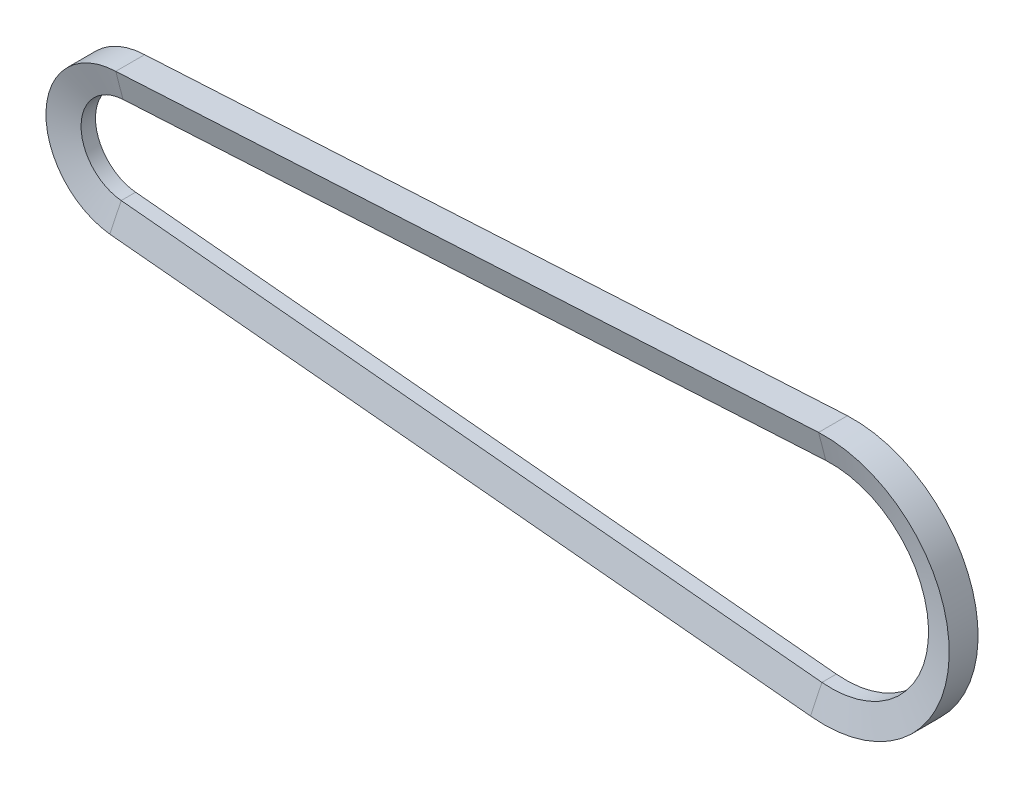
ISO-10303-21;
HEADER;
FILE_DESCRIPTION(('STEP AP214'),'2;1');
FILE_NAME('part.step','',(''),(''),'','','');
FILE_SCHEMA(('AUTOMOTIVE_DESIGN { 1 0 10303 214 1 1 1 1 }'));
ENDSEC;
DATA;
#1=APPLICATION_CONTEXT('core data for automotive mechanical design processes');
#2=APPLICATION_PROTOCOL_DEFINITION('international standard','automotive_design',2000,#1);
#3=PRODUCT_CONTEXT('',#1,'mechanical');
#4=PRODUCT('Part','Part','',(#3));
#5=PRODUCT_RELATED_PRODUCT_CATEGORY('part','',(#4));
#6=PRODUCT_DEFINITION_FORMATION('','',#4);
#7=PRODUCT_DEFINITION_CONTEXT('part definition',#1,'design');
#8=PRODUCT_DEFINITION('design','',#6,#7);
#9=PRODUCT_DEFINITION_SHAPE('','',#8);
#10=(LENGTH_UNIT() NAMED_UNIT(*) SI_UNIT(.MILLI.,.METRE.));
#11=(NAMED_UNIT(*) PLANE_ANGLE_UNIT() SI_UNIT($,.RADIAN.));
#12=(NAMED_UNIT(*) SI_UNIT($,.STERADIAN.) SOLID_ANGLE_UNIT());
#13=UNCERTAINTY_MEASURE_WITH_UNIT(LENGTH_MEASURE(1.E-05),#10,'distance_accuracy_value','');
#14=(GEOMETRIC_REPRESENTATION_CONTEXT(3) GLOBAL_UNCERTAINTY_ASSIGNED_CONTEXT((#13)) GLOBAL_UNIT_ASSIGNED_CONTEXT((#10,
#11,#12)) REPRESENTATION_CONTEXT('',''));
#15=CARTESIAN_POINT('',(0.,0.,0.));
#16=DIRECTION('',(0.,0.,1.));
#17=DIRECTION('',(1.,0.,0.));
#18=AXIS2_PLACEMENT_3D('',#15,#16,#17);
#19=CARTESIAN_POINT('',(-1.86422081923545,-17.2680872712014,2.));
#20=CARTESIAN_POINT('',(8.86465794915136,-18.4263510008753,2.));
#21=CARTESIAN_POINT('',(17.0099433516367,-11.3478808126017,2.));
#22=CARTESIAN_POINT('',(17.3593189672023,-0.562318649530724,2.));
#23=CARTESIAN_POINT('',(17.708694582768,10.2232435135402,2.));
#24=CARTESIAN_POINT('',(10.0385885943282,17.8140200627688,2.));
#25=CARTESIAN_POINT('',(-0.742758535199014,17.3525348876492,2.));
#26=CARTESIAN_POINT('',(-1.28422785180058,-13.4387781745462,0.999999999999999));
#27=CARTESIAN_POINT('',(7.06545324289761,-14.2366850137089,0.999999999999999));
#28=CARTESIAN_POINT('',(13.3285825573353,-8.65752370596974,0.999999999999999));
#29=CARTESIAN_POINT('',(13.497269617516,-0.271501145609515,0.999999999999999));
#30=CARTESIAN_POINT('',(13.6659566776966,8.11452141475071,0.999999999999999));
#31=CARTESIAN_POINT('',(7.63225556271675,13.9410367165614,0.999999999999999));
#32=CARTESIAN_POINT('',(-0.742758535199014,13.4795515414418,0.999999999999999));
#33=(BOUNDED_SURFACE() B_SPLINE_SURFACE(1,3,((#19,#20,#21,#22,#23,#24,#25),(#26,#27,#28,#29,#30,
#31,#32)),.UNSPECIFIED.,.F.,.F.,.F.) B_SPLINE_SURFACE_WITH_KNOTS((2,2),(4,3,4),(0.,1.),(0.,0.5,
1.),.UNSPECIFIED.) GEOMETRIC_REPRESENTATION_ITEM() RATIONAL_B_SPLINE_SURFACE(((1.,
0.786693931378275,0.786693931378275,1.,0.786693931378275,0.786693931378275,1.),(1.,
0.786693931378275,0.786693931378275,1.,0.786693931378275,0.786693931378275,1.))) REPRESENTATION_ITEM('') SURFACE());
#34=DIRECTION('',(0.144998241858716,0.957327274163795,-0.25));
#35=VECTOR('',#34,1.);
#36=CARTESIAN_POINT('',(-1.86422081923545,-17.2680872712014,2.));
#37=LINE('',#36,#35);
#38=CARTESIAN_POINT('',(-1.86422081923544,-17.2680872712016,2.));
#39=VERTEX_POINT('',#38);
#40=CARTESIAN_POINT('',(-1.28422785180059,-13.4387781745464,0.999999999999999));
#41=VERTEX_POINT('',#40);
#42=EDGE_CURVE('E149',#39,#41,#37,.T.);
#43=CARTESIAN_POINT('',(-4.16333634234434E-13,0.,2.));
#44=DIRECTION('',(0.,0.,1.));
#45=DIRECTION('',(-0.107333906847763,-0.994223029526472,0.));
#46=AXIS2_PLACEMENT_3D('',#43,#44,#45);
#47=CIRCLE('',#46,17.3684241446567);
#48=CARTESIAN_POINT('',(-0.742758535198196,17.3525348876494,2.));
#49=VERTEX_POINT('',#48);
#50=EDGE_CURVE('E148',#39,#49,#47,.T.);
#51=DIRECTION('',(0.,-0.968245836551854,-0.25));
#52=VECTOR('',#51,1.);
#53=CARTESIAN_POINT('',(-0.742758535198196,17.3525348876494,2.));
#54=LINE('',#53,#52);
#55=CARTESIAN_POINT('',(-0.742758535198196,13.479551541442,0.999999999999999));
#56=VERTEX_POINT('',#55);
#57=EDGE_CURVE('E127',#49,#56,#54,.T.);
#58=CARTESIAN_POINT('',(-4.16333634234434E-13,0.,0.999999999999999));
#59=DIRECTION('',(0.,0.,1.));
#60=DIRECTION('',(-0.0951279890222352,-0.995465049966389,0.));
#61=AXIS2_PLACEMENT_3D('',#58,#59,#60);
#62=CIRCLE('',#61,13.4999999999999);
#63=EDGE_CURVE('E153',#41,#56,#62,.T.);
#64=ORIENTED_EDGE('',*,*,#42,.F.);
#65=ORIENTED_EDGE('',*,*,#50,.T.);
#66=ORIENTED_EDGE('',*,*,#57,.T.);
#67=ORIENTED_EDGE('',*,*,#63,.F.);
#68=EDGE_LOOP('',(#64,#65,#66,#67));
#69=FACE_BOUND('',#68,.T.);
#70=ADVANCED_FACE('F33',(#69),#33,.F.);
#71=CARTESIAN_POINT('',(-0.742758535198196,17.3525348876494,2.));
#72=DIRECTION('',(-0.0137743467727217,0.249976282296314,-0.968153978280469));
#73=DIRECTION('',(0.,0.968245836551854,0.25));
#74=AXIS2_PLACEMENT_3D('',#71,#72,#73);
#75=PLANE('',#74);
#76=DIRECTION('',(-0.998485299366073,-0.0550191507553911,0.));
#77=VECTOR('',#76,1.);
#78=CARTESIAN_POINT('',(-0.742758535198196,13.479551541442,0.999999999999999));
#79=LINE('',#78,#77);
#80=CARTESIAN_POINT('',(-98.187271650224,8.11010407860489,0.999999999999999));
#81=VERTEX_POINT('',#80);
#82=EDGE_CURVE('E117',#56,#81,#79,.T.);
#83=ORIENTED_EDGE('',*,*,#82,.F.);
#84=ORIENTED_EDGE('',*,*,#57,.F.);
#85=DIRECTION('',(-0.998485299366073,-0.0550191507553911,0.));
#86=VECTOR('',#85,1.);
#87=CARTESIAN_POINT('',(-0.742758535198196,17.3525348876494,2.));
#88=LINE('',#87,#86);
#89=CARTESIAN_POINT('',(-98.187271650224,11.9830874248123,2.));
#90=VERTEX_POINT('',#89);
#91=EDGE_CURVE('E130',#49,#90,#88,.T.);
#92=ORIENTED_EDGE('',*,*,#91,.T.);
#93=DIRECTION('',(0.,-0.968245836551854,-0.25));
#94=VECTOR('',#93,1.);
#95=CARTESIAN_POINT('',(-98.187271650224,11.9830874248123,2.));
#96=LINE('',#95,#94);
#97=EDGE_CURVE('E145',#90,#81,#96,.T.);
#98=ORIENTED_EDGE('',*,*,#97,.T.);
#99=EDGE_LOOP('',(#83,#84,#92,#98));
#100=FACE_BOUND('',#99,.T.);
#101=ADVANCED_FACE('F129',(#100),#75,.F.);
#102=CARTESIAN_POINT('',(-0.742758535198196,13.479551541442,-1.));
#103=DIRECTION('',(-0.0550191507553911,0.998485299366073,0.));
#104=DIRECTION('',(-0.998485299366073,-0.0550191507553911,0.));
#105=AXIS2_PLACEMENT_3D('',#102,#103,#104);
#106=PLANE('',#105);
#107=DIRECTION('',(-0.998485299366073,-0.0550191507553911,0.));
#108=VECTOR('',#107,1.);
#109=CARTESIAN_POINT('',(-0.742758535198196,13.479551541442,-1.));
#110=LINE('',#109,#108);
#111=CARTESIAN_POINT('',(-0.742758535198196,13.479551541442,-1.));
#112=VERTEX_POINT('',#111);
#113=CARTESIAN_POINT('',(-98.187271650224,8.11010407860489,-1.));
#114=VERTEX_POINT('',#113);
#115=EDGE_CURVE('E111',#112,#114,#110,.T.);
#116=ORIENTED_EDGE('',*,*,#115,.F.);
#117=DIRECTION('',(0.,0.,-1.));
#118=VECTOR('',#117,1.);
#119=CARTESIAN_POINT('',(-0.742758535198196,13.479551541442,-1.));
#120=LINE('',#119,#118);
#121=EDGE_CURVE('E135',#56,#112,#120,.T.);
#122=ORIENTED_EDGE('',*,*,#121,.F.);
#123=ORIENTED_EDGE('',*,*,#82,.T.);
#124=DIRECTION('',(0.,0.,-1.));
#125=VECTOR('',#124,1.);
#126=CARTESIAN_POINT('',(-98.187271650224,8.11010407860489,-1.));
#127=LINE('',#126,#125);
#128=EDGE_CURVE('E200',#81,#114,#127,.T.);
#129=ORIENTED_EDGE('',*,*,#128,.T.);
#130=EDGE_LOOP('',(#116,#122,#123,#129));
#131=FACE_BOUND('',#130,.T.);
#132=ADVANCED_FACE('F216',(#131),#106,.F.);
#133=CARTESIAN_POINT('',(-0.742758535198196,17.3525348876494,-2.));
#134=DIRECTION('',(-0.0137743467727217,0.249976282296314,0.968153978280469));
#135=DIRECTION('',(0.,-0.968245836551854,0.25));
#136=AXIS2_PLACEMENT_3D('',#133,#134,#135);
#137=PLANE('',#136);
#138=DIRECTION('',(-0.998485299366073,-0.0550191507553911,0.));
#139=VECTOR('',#138,1.);
#140=CARTESIAN_POINT('',(-0.742758535198196,17.3525348876494,-2.));
#141=LINE('',#140,#139);
#142=CARTESIAN_POINT('',(-0.742758535198196,17.3525348876494,-2.));
#143=VERTEX_POINT('',#142);
#144=CARTESIAN_POINT('',(-98.187271650224,11.9830874248123,-2.));
#145=VERTEX_POINT('',#144);
#146=EDGE_CURVE('E163',#143,#145,#141,.T.);
#147=ORIENTED_EDGE('',*,*,#146,.F.);
#148=DIRECTION('',(0.,0.968245836551854,-0.25));
#149=VECTOR('',#148,1.);
#150=CARTESIAN_POINT('',(-0.742758535198196,17.3525348876494,-2.));
#151=LINE('',#150,#149);
#152=EDGE_CURVE('E156',#112,#143,#151,.T.);
#153=ORIENTED_EDGE('',*,*,#152,.F.);
#154=ORIENTED_EDGE('',*,*,#115,.T.);
#155=DIRECTION('',(0.,0.968245836551854,-0.25));
#156=VECTOR('',#155,1.);
#157=CARTESIAN_POINT('',(-98.187271650224,11.9830874248123,-2.));
#158=LINE('',#157,#156);
#159=EDGE_CURVE('E185',#114,#145,#158,.T.);
#160=ORIENTED_EDGE('',*,*,#159,.T.);
#161=EDGE_LOOP('',(#147,#153,#154,#160));
#162=FACE_BOUND('',#161,.T.);
#163=ADVANCED_FACE('F186',(#162),#137,.F.);
#164=CARTESIAN_POINT('',(-0.742758535198196,17.3525348876494,2.));
#165=DIRECTION('',(0.0550191507553911,-0.998485299366073,0.));
#166=DIRECTION('',(0.998485299366073,0.0550191507553911,0.));
#167=AXIS2_PLACEMENT_3D('',#164,#165,#166);
#168=PLANE('',#167);
#169=DIRECTION('',(0.,0.,1.));
#170=VECTOR('',#169,1.);
#171=CARTESIAN_POINT('',(-98.187271650224,11.9830874248123,2.));
#172=LINE('',#171,#170);
#173=EDGE_CURVE('E143',#145,#90,#172,.T.);
#174=ORIENTED_EDGE('',*,*,#173,.T.);
#175=ORIENTED_EDGE('',*,*,#91,.F.);
#176=DIRECTION('',(0.,0.,1.));
#177=VECTOR('',#176,1.);
#178=CARTESIAN_POINT('',(-0.742758535198196,17.3525348876494,2.));
#179=LINE('',#178,#177);
#180=EDGE_CURVE('E142',#143,#49,#179,.T.);
#181=ORIENTED_EDGE('',*,*,#180,.F.);
#182=ORIENTED_EDGE('',*,*,#146,.T.);
#183=EDGE_LOOP('',(#174,#175,#181,#182));
#184=FACE_BOUND('',#183,.T.);
#185=ADVANCED_FACE('F140',(#184),#168,.F.);
#186=CARTESIAN_POINT('',(-98.187271650224,11.9830874248123,2.));
#187=CARTESIAN_POINT('',(-115.552519547685,11.3962623792647,2.));
#188=CARTESIAN_POINT('',(-116.271286067996,-5.96402485521493,2.));
#189=CARTESIAN_POINT('',(-99.013980739172,-7.98432457607279,2.));
#190=CARTESIAN_POINT('',(-98.187271650224,8.11010407860489,0.999999999999999));
#191=CARTESIAN_POINT('',(-108.836948594242,7.5232790330573,0.999999999999999));
#192=CARTESIAN_POINT('',(-109.051451241588,-3.14039628365708,0.999999999999999));
#193=CARTESIAN_POINT('',(-98.4339877717372,-4.15501547941761,0.999999999999999));
#194=(BOUNDED_SURFACE() B_SPLINE_SURFACE(1,3,((#186,#187,#188,#189),(#190,#191,#192,#193)),
.UNSPECIFIED.,.F.,.F.,.F.) B_SPLINE_SURFACE_WITH_KNOTS((2,2),(4,4),(0.,1.),(0.,1.),
.UNSPECIFIED.) GEOMETRIC_REPRESENTATION_ITEM() RATIONAL_B_SPLINE_SURFACE(((1.,0.383392504420998,
0.383392504420998,1.),(1.,0.383392504420998,0.383392504420998,1.))) REPRESENTATION_ITEM('') SURFACE());
#195=CARTESIAN_POINT('',(-97.8488397217552,1.96825527191182,0.999999999999999));
#196=DIRECTION('',(0.,0.,1.));
#197=DIRECTION('',(-0.0550191507553888,0.998485299366073,0.));
#198=AXIS2_PLACEMENT_3D('',#195,#196,#197);
#199=CIRCLE('',#198,6.15116598170495);
#200=CARTESIAN_POINT('',(-98.4339877717372,-4.15501547941761,0.999999999999999));
#201=VERTEX_POINT('',#200);
#202=EDGE_CURVE('E98',#81,#201,#199,.T.);
#203=CARTESIAN_POINT('',(-97.8488397217552,1.96825527191182,2.));
#204=DIRECTION('',(0.,0.,1.));
#205=DIRECTION('',(-0.0337737915949164,0.999429502767105,0.));
#206=AXIS2_PLACEMENT_3D('',#203,#204,#205);
#207=CIRCLE('',#206,10.0205488482905);
#208=CARTESIAN_POINT('',(-99.013980739172,-7.98432457607279,2.));
#209=VERTEX_POINT('',#208);
#210=EDGE_CURVE('E162',#90,#209,#207,.T.);
#211=DIRECTION('',(0.144998241858716,0.957327274163795,-0.25));
#212=VECTOR('',#211,1.);
#213=CARTESIAN_POINT('',(-99.013980739172,-7.98432457607279,2.));
#214=LINE('',#213,#212);
#215=EDGE_CURVE('E191',#209,#201,#214,.T.);
#216=ORIENTED_EDGE('',*,*,#202,.F.);
#217=ORIENTED_EDGE('',*,*,#97,.F.);
#218=ORIENTED_EDGE('',*,*,#210,.T.);
#219=ORIENTED_EDGE('',*,*,#215,.T.);
#220=EDGE_LOOP('',(#216,#217,#218,#219));
#221=FACE_BOUND('',#220,.T.);
#222=ADVANCED_FACE('F215',(#221),#194,.F.);
#223=CARTESIAN_POINT('',(-97.8488397217552,1.96825527191182,0.));
#224=DIRECTION('',(0.,0.,1.));
#225=DIRECTION('',(1.,0.,0.));
#226=AXIS2_PLACEMENT_3D('',#223,#224,#225);
#227=CYLINDRICAL_SURFACE('',#226,6.15116598170495);
#228=CARTESIAN_POINT('',(-97.8488397217552,1.96825527191182,-1.));
#229=DIRECTION('',(0.,0.,1.));
#230=DIRECTION('',(-0.0550191507553888,0.998485299366073,0.));
#231=AXIS2_PLACEMENT_3D('',#228,#229,#230);
#232=CIRCLE('',#231,6.15116598170495);
#233=CARTESIAN_POINT('',(-98.4339877717372,-4.15501547941761,-1.));
#234=VERTEX_POINT('',#233);
#235=EDGE_CURVE('E91',#114,#234,#232,.T.);
#236=ORIENTED_EDGE('',*,*,#235,.F.);
#237=ORIENTED_EDGE('',*,*,#128,.F.);
#238=ORIENTED_EDGE('',*,*,#202,.T.);
#239=DIRECTION('',(0.,0.,-1.));
#240=VECTOR('',#239,1.);
#241=CARTESIAN_POINT('',(-98.4339877717372,-4.15501547941761,-1.));
#242=LINE('',#241,#240);
#243=EDGE_CURVE('E203',#201,#234,#242,.T.);
#244=ORIENTED_EDGE('',*,*,#243,.T.);
#245=EDGE_LOOP('',(#236,#237,#238,#244));
#246=FACE_BOUND('',#245,.T.);
#247=ADVANCED_FACE('F205',(#246),#227,.F.);
#248=CARTESIAN_POINT('',(-98.187271650224,8.11010407860489,-1.));
#249=CARTESIAN_POINT('',(-108.836948594242,7.5232790330573,-1.));
#250=CARTESIAN_POINT('',(-109.051451241588,-3.14039628365708,-1.));
#251=CARTESIAN_POINT('',(-98.4339877717372,-4.15501547941761,-1.));
#252=CARTESIAN_POINT('',(-98.187271650224,11.9830874248123,-2.));
#253=CARTESIAN_POINT('',(-115.552519547685,11.3962623792647,-2.));
#254=CARTESIAN_POINT('',(-116.271286067996,-5.96402485521493,-2.));
#255=CARTESIAN_POINT('',(-99.013980739172,-7.98432457607279,-2.));
#256=(BOUNDED_SURFACE() B_SPLINE_SURFACE(1,3,((#248,#249,#250,#251),(#252,#253,#254,#255)),
.UNSPECIFIED.,.F.,.F.,.F.) B_SPLINE_SURFACE_WITH_KNOTS((2,2),(4,4),(0.,1.),(0.,1.),
.UNSPECIFIED.) GEOMETRIC_REPRESENTATION_ITEM() RATIONAL_B_SPLINE_SURFACE(((1.,0.383392504420998,
0.383392504420998,1.),(1.,0.383392504420998,0.383392504420998,1.))) REPRESENTATION_ITEM('') SURFACE());
#257=CARTESIAN_POINT('',(-97.8488397217552,1.96825527191182,-2.));
#258=DIRECTION('',(0.,0.,1.));
#259=DIRECTION('',(-0.0337737915949164,0.999429502767105,0.));
#260=AXIS2_PLACEMENT_3D('',#257,#258,#259);
#261=CIRCLE('',#260,10.0205488482905);
#262=CARTESIAN_POINT('',(-99.013980739172,-7.98432457607279,-2.));
#263=VERTEX_POINT('',#262);
#264=EDGE_CURVE('E82',#145,#263,#261,.T.);
#265=DIRECTION('',(-0.144998241858716,-0.957327274163795,-0.25));
#266=VECTOR('',#265,1.);
#267=CARTESIAN_POINT('',(-99.013980739172,-7.98432457607279,-2.));
#268=LINE('',#267,#266);
#269=EDGE_CURVE('E169',#234,#263,#268,.T.);
#270=ORIENTED_EDGE('',*,*,#264,.F.);
#271=ORIENTED_EDGE('',*,*,#159,.F.);
#272=ORIENTED_EDGE('',*,*,#235,.T.);
#273=ORIENTED_EDGE('',*,*,#269,.T.);
#274=EDGE_LOOP('',(#270,#271,#272,#273));
#275=FACE_BOUND('',#274,.T.);
#276=ADVANCED_FACE('F187',(#275),#256,.F.);
#277=CARTESIAN_POINT('',(-97.8488397217552,1.96825527191182,0.));
#278=DIRECTION('',(0.,0.,1.));
#279=DIRECTION('',(1.,0.,0.));
#280=AXIS2_PLACEMENT_3D('',#277,#278,#279);
#281=CYLINDRICAL_SURFACE('',#280,10.0205488482905);
#282=DIRECTION('',(0.,0.,1.));
#283=VECTOR('',#282,1.);
#284=CARTESIAN_POINT('',(-99.013980739172,-7.98432457607279,2.));
#285=LINE('',#284,#283);
#286=EDGE_CURVE('E164',#263,#209,#285,.T.);
#287=ORIENTED_EDGE('',*,*,#286,.T.);
#288=ORIENTED_EDGE('',*,*,#210,.F.);
#289=ORIENTED_EDGE('',*,*,#173,.F.);
#290=ORIENTED_EDGE('',*,*,#264,.T.);
#291=EDGE_LOOP('',(#287,#288,#289,#290));
#292=FACE_BOUND('',#291,.T.);
#293=ADVANCED_FACE('F188',(#292),#281,.T.);
#294=CARTESIAN_POINT('',(-99.013980739172,-7.98432457607279,2.));
#295=DIRECTION('',(-0.0238158148679962,-0.249220146260039,-0.968153978280469));
#296=DIRECTION('',(0.,0.968428660232274,-0.249290854306217));
#297=AXIS2_PLACEMENT_3D('',#294,#295,#296);
#298=PLANE('',#297);
#299=DIRECTION('',(0.995465049966383,-0.0951279890222959,0.));
#300=VECTOR('',#299,1.);
#301=CARTESIAN_POINT('',(-98.4339877717372,-4.15501547941761,0.999999999999999));
#302=LINE('',#301,#300);
#303=EDGE_CURVE('E167',#201,#41,#302,.T.);
#304=ORIENTED_EDGE('',*,*,#303,.F.);
#305=ORIENTED_EDGE('',*,*,#215,.F.);
#306=DIRECTION('',(0.995465049966383,-0.0951279890222959,0.));
#307=VECTOR('',#306,1.);
#308=CARTESIAN_POINT('',(-99.013980739172,-7.98432457607279,2.));
#309=LINE('',#308,#307);
#310=EDGE_CURVE('E165',#209,#39,#309,.T.);
#311=ORIENTED_EDGE('',*,*,#310,.T.);
#312=ORIENTED_EDGE('',*,*,#42,.T.);
#313=EDGE_LOOP('',(#304,#305,#311,#312));
#314=FACE_BOUND('',#313,.T.);
#315=ADVANCED_FACE('F214',(#314),#298,.F.);
#316=CARTESIAN_POINT('',(-98.4339877717372,-4.15501547941761,-1.));
#317=DIRECTION('',(-0.0951279890222958,-0.995465049966383,0.));
#318=DIRECTION('',(0.995465049966383,-0.0951279890222959,0.));
#319=AXIS2_PLACEMENT_3D('',#316,#317,#318);
#320=PLANE('',#319);
#321=DIRECTION('',(0.995465049966383,-0.0951279890222959,0.));
#322=VECTOR('',#321,1.);
#323=CARTESIAN_POINT('',(-98.4339877717372,-4.15501547941761,-1.));
#324=LINE('',#323,#322);
#325=CARTESIAN_POINT('',(-1.28422785180059,-13.4387781745464,-1.));
#326=VERTEX_POINT('',#325);
#327=EDGE_CURVE('E58',#234,#326,#324,.T.);
#328=ORIENTED_EDGE('',*,*,#327,.F.);
#329=ORIENTED_EDGE('',*,*,#243,.F.);
#330=ORIENTED_EDGE('',*,*,#303,.T.);
#331=DIRECTION('',(0.,0.,-1.));
#332=VECTOR('',#331,1.);
#333=CARTESIAN_POINT('',(-1.28422785180058,-13.4387781745462,-1.));
#334=LINE('',#333,#332);
#335=EDGE_CURVE('E175',#41,#326,#334,.T.);
#336=ORIENTED_EDGE('',*,*,#335,.T.);
#337=EDGE_LOOP('',(#328,#329,#330,#336));
#338=FACE_BOUND('',#337,.T.);
#339=ADVANCED_FACE('F207',(#338),#320,.F.);
#340=CARTESIAN_POINT('',(-99.013980739172,-7.98432457607279,-2.));
#341=DIRECTION('',(-0.0238158148679961,-0.249220146260038,0.968153978280469));
#342=DIRECTION('',(0.,-0.968428660232274,-0.249290854306217));
#343=AXIS2_PLACEMENT_3D('',#340,#341,#342);
#344=PLANE('',#343);
#345=DIRECTION('',(0.995465049966383,-0.0951279890222959,0.));
#346=VECTOR('',#345,1.);
#347=CARTESIAN_POINT('',(-99.013980739172,-7.98432457607279,-2.));
#348=LINE('',#347,#346);
#349=CARTESIAN_POINT('',(-1.86422081923544,-17.2680872712016,-2.));
#350=VERTEX_POINT('',#349);
#351=EDGE_CURVE('E50',#263,#350,#348,.T.);
#352=ORIENTED_EDGE('',*,*,#351,.F.);
#353=ORIENTED_EDGE('',*,*,#269,.F.);
#354=ORIENTED_EDGE('',*,*,#327,.T.);
#355=DIRECTION('',(-0.144998241858716,-0.957327274163795,-0.25));
#356=VECTOR('',#355,1.);
#357=CARTESIAN_POINT('',(-1.86422081923545,-17.2680872712014,-2.));
#358=LINE('',#357,#356);
#359=EDGE_CURVE('E174',#326,#350,#358,.T.);
#360=ORIENTED_EDGE('',*,*,#359,.T.);
#361=EDGE_LOOP('',(#352,#353,#354,#360));
#362=FACE_BOUND('',#361,.T.);
#363=ADVANCED_FACE('F210',(#362),#344,.F.);
#364=CARTESIAN_POINT('',(-99.013980739172,-7.98432457607279,2.));
#365=DIRECTION('',(0.0951279890222958,0.995465049966383,0.));
#366=DIRECTION('',(-0.995465049966383,0.0951279890222959,0.));
#367=AXIS2_PLACEMENT_3D('',#364,#365,#366);
#368=PLANE('',#367);
#369=DIRECTION('',(0.,0.,1.));
#370=VECTOR('',#369,1.);
#371=CARTESIAN_POINT('',(-1.86422081923545,-17.2680872712014,2.));
#372=LINE('',#371,#370);
#373=EDGE_CURVE('E37',#350,#39,#372,.T.);
#374=ORIENTED_EDGE('',*,*,#373,.T.);
#375=ORIENTED_EDGE('',*,*,#310,.F.);
#376=ORIENTED_EDGE('',*,*,#286,.F.);
#377=ORIENTED_EDGE('',*,*,#351,.T.);
#378=EDGE_LOOP('',(#374,#375,#376,#377));
#379=FACE_BOUND('',#378,.T.);
#380=ADVANCED_FACE('F211',(#379),#368,.F.);
#381=CARTESIAN_POINT('',(-4.16333634234434E-13,0.,0.));
#382=DIRECTION('',(0.,0.,1.));
#383=DIRECTION('',(1.,0.,0.));
#384=AXIS2_PLACEMENT_3D('',#381,#382,#383);
#385=CYLINDRICAL_SURFACE('',#384,13.4999999999999);
#386=ORIENTED_EDGE('',*,*,#63,.T.);
#387=ORIENTED_EDGE('',*,*,#121,.T.);
#388=CARTESIAN_POINT('',(-4.16333634234434E-13,0.,-1.));
#389=DIRECTION('',(0.,0.,1.));
#390=DIRECTION('',(-0.0951279890222352,-0.995465049966389,0.));
#391=AXIS2_PLACEMENT_3D('',#388,#389,#390);
#392=CIRCLE('',#391,13.4999999999999);
#393=EDGE_CURVE('E42',#326,#112,#392,.T.);
#394=ORIENTED_EDGE('',*,*,#393,.F.);
#395=ORIENTED_EDGE('',*,*,#335,.F.);
#396=EDGE_LOOP('',(#386,#387,#394,#395));
#397=FACE_BOUND('',#396,.T.);
#398=ADVANCED_FACE('F219',(#397),#385,.F.);
#399=CARTESIAN_POINT('',(-1.28422785180058,-13.4387781745462,-1.));
#400=CARTESIAN_POINT('',(7.06545324289761,-14.2366850137089,-1.));
#401=CARTESIAN_POINT('',(13.3285825573353,-8.65752370596974,-1.));
#402=CARTESIAN_POINT('',(13.497269617516,-0.271501145609515,-1.));
#403=CARTESIAN_POINT('',(13.6659566776966,8.11452141475071,-1.));
#404=CARTESIAN_POINT('',(7.63225556271675,13.9410367165614,-1.));
#405=CARTESIAN_POINT('',(-0.742758535199014,13.4795515414418,-1.));
#406=CARTESIAN_POINT('',(-1.86422081923545,-17.2680872712014,-2.));
#407=CARTESIAN_POINT('',(8.86465794915136,-18.4263510008753,-2.));
#408=CARTESIAN_POINT('',(17.0099433516367,-11.3478808126017,-2.));
#409=CARTESIAN_POINT('',(17.3593189672023,-0.562318649530724,-2.));
#410=CARTESIAN_POINT('',(17.708694582768,10.2232435135402,-2.));
#411=CARTESIAN_POINT('',(10.0385885943282,17.8140200627688,-2.));
#412=CARTESIAN_POINT('',(-0.742758535199014,17.3525348876492,-2.));
#413=(BOUNDED_SURFACE() B_SPLINE_SURFACE(1,3,((#399,#400,#401,#402,#403,#404,#405),(#406,#407,
#408,#409,#410,#411,#412)),.UNSPECIFIED.,.F.,.F.,.F.) B_SPLINE_SURFACE_WITH_KNOTS((2,2),(4,3,4),
(0.,1.),(0.,0.5,1.),
.UNSPECIFIED.) GEOMETRIC_REPRESENTATION_ITEM() RATIONAL_B_SPLINE_SURFACE(((1.,0.786693931378275,
0.786693931378275,1.,0.786693931378275,0.786693931378275,1.),(1.,0.786693931378275,
0.786693931378275,1.,0.786693931378275,0.786693931378275,1.))) REPRESENTATION_ITEM('') SURFACE());
#414=CARTESIAN_POINT('',(-4.16333634234434E-13,0.,-2.));
#415=DIRECTION('',(0.,0.,1.));
#416=DIRECTION('',(-0.107333906847763,-0.994223029526472,0.));
#417=AXIS2_PLACEMENT_3D('',#414,#415,#416);
#418=CIRCLE('',#417,17.3684241446567);
#419=EDGE_CURVE('E11',#350,#143,#418,.T.);
#420=ORIENTED_EDGE('',*,*,#393,.T.);
#421=ORIENTED_EDGE('',*,*,#152,.T.);
#422=ORIENTED_EDGE('',*,*,#419,.F.);
#423=ORIENTED_EDGE('',*,*,#359,.F.);
#424=EDGE_LOOP('',(#420,#421,#422,#423));
#425=FACE_BOUND('',#424,.T.);
#426=ADVANCED_FACE('F221',(#425),#413,.F.);
#427=CARTESIAN_POINT('',(-4.16333634234434E-13,0.,0.));
#428=DIRECTION('',(0.,0.,1.));
#429=DIRECTION('',(1.,0.,0.));
#430=AXIS2_PLACEMENT_3D('',#427,#428,#429);
#431=CYLINDRICAL_SURFACE('',#430,17.3684241446567);
#432=ORIENTED_EDGE('',*,*,#419,.T.);
#433=ORIENTED_EDGE('',*,*,#180,.T.);
#434=ORIENTED_EDGE('',*,*,#50,.F.);
#435=ORIENTED_EDGE('',*,*,#373,.F.);
#436=EDGE_LOOP('',(#432,#433,#434,#435));
#437=FACE_BOUND('',#436,.T.);
#438=ADVANCED_FACE('F35',(#437),#431,.T.);
#439=CLOSED_SHELL('',(#70,#101,#132,#163,#185,#222,#247,#276,#293,#315,#339,#363,#380,#398,#426,#438));
#440=MANIFOLD_SOLID_BREP('B2',#439);
#441=ADVANCED_BREP_SHAPE_REPRESENTATION('',(#18,#440),#14);
#442=SHAPE_DEFINITION_REPRESENTATION(#9,#441);
ENDSEC;
END-ISO-10303-21;
